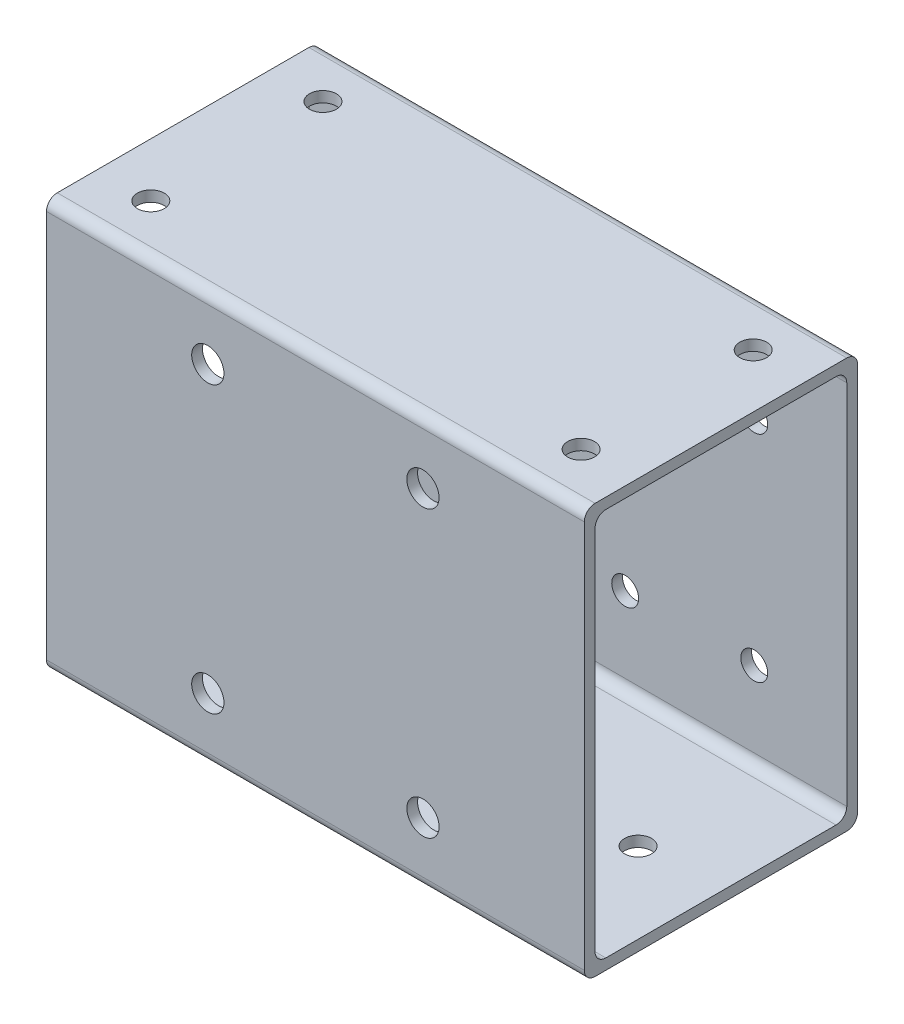
ISO-10303-21;
HEADER;
FILE_DESCRIPTION(('STEP AP214'),'2;1');
FILE_NAME('part.step','',(''),(''),'','','');
FILE_SCHEMA(('AUTOMOTIVE_DESIGN { 1 0 10303 214 1 1 1 1 }'));
ENDSEC;
DATA;
#1=APPLICATION_CONTEXT('core data for automotive mechanical design processes');
#2=APPLICATION_PROTOCOL_DEFINITION('international standard','automotive_design',2000,#1);
#3=PRODUCT_CONTEXT('',#1,'mechanical');
#4=PRODUCT('Part','Part','',(#3));
#5=PRODUCT_RELATED_PRODUCT_CATEGORY('part','',(#4));
#6=PRODUCT_DEFINITION_FORMATION('','',#4);
#7=PRODUCT_DEFINITION_CONTEXT('part definition',#1,'design');
#8=PRODUCT_DEFINITION('design','',#6,#7);
#9=PRODUCT_DEFINITION_SHAPE('','',#8);
#10=(LENGTH_UNIT() NAMED_UNIT(*) SI_UNIT(.MILLI.,.METRE.));
#11=(NAMED_UNIT(*) PLANE_ANGLE_UNIT() SI_UNIT($,.RADIAN.));
#12=(NAMED_UNIT(*) SI_UNIT($,.STERADIAN.) SOLID_ANGLE_UNIT());
#13=UNCERTAINTY_MEASURE_WITH_UNIT(LENGTH_MEASURE(1.E-05),#10,'distance_accuracy_value','');
#14=(GEOMETRIC_REPRESENTATION_CONTEXT(3) GLOBAL_UNCERTAINTY_ASSIGNED_CONTEXT((#13)) GLOBAL_UNIT_ASSIGNED_CONTEXT((#10,
#11,#12)) REPRESENTATION_CONTEXT('',''));
#15=CARTESIAN_POINT('',(0.,0.,0.));
#16=DIRECTION('',(0.,0.,1.));
#17=DIRECTION('',(1.,0.,0.));
#18=AXIS2_PLACEMENT_3D('',#15,#16,#17);
#19=CARTESIAN_POINT('',(-100.,38.1,25.4));
#20=DIRECTION('',(0.,0.,1.));
#21=DIRECTION('',(0.,-1.,0.));
#22=AXIS2_PLACEMENT_3D('',#19,#20,#21);
#23=PLANE('',#22);
#24=CARTESIAN_POINT('',(-30.,-26.5,25.4));
#25=DIRECTION('',(0.,0.,1.));
#26=DIRECTION('',(1.,0.,0.));
#27=AXIS2_PLACEMENT_3D('',#24,#25,#26);
#28=CIRCLE('',#27,3.);
#29=CARTESIAN_POINT('',(-27.,-26.5,25.4));
#30=VERTEX_POINT('',#29);
#31=EDGE_CURVE('E320',#30,#30,#28,.T.);
#32=ORIENTED_EDGE('',*,*,#31,.F.);
#33=EDGE_LOOP('',(#32));
#34=FACE_BOUND('',#33,.T.);
#35=CARTESIAN_POINT('',(-70.,-26.5,25.4));
#36=DIRECTION('',(0.,0.,1.));
#37=DIRECTION('',(1.,0.,0.));
#38=AXIS2_PLACEMENT_3D('',#35,#36,#37);
#39=CIRCLE('',#38,3.00000000000001);
#40=CARTESIAN_POINT('',(-67.,-26.5,25.4));
#41=VERTEX_POINT('',#40);
#42=EDGE_CURVE('E377',#41,#41,#39,.T.);
#43=ORIENTED_EDGE('',*,*,#42,.F.);
#44=EDGE_LOOP('',(#43));
#45=FACE_BOUND('',#44,.T.);
#46=CARTESIAN_POINT('',(-70.,26.5,25.4));
#47=DIRECTION('',(0.,0.,1.));
#48=DIRECTION('',(1.,0.,0.));
#49=AXIS2_PLACEMENT_3D('',#46,#47,#48);
#50=CIRCLE('',#49,3.00000000000001);
#51=CARTESIAN_POINT('',(-67.,26.5,25.4));
#52=VERTEX_POINT('',#51);
#53=EDGE_CURVE('E373',#52,#52,#50,.T.);
#54=ORIENTED_EDGE('',*,*,#53,.F.);
#55=EDGE_LOOP('',(#54));
#56=FACE_BOUND('',#55,.T.);
#57=CARTESIAN_POINT('',(-30.,26.5,25.4));
#58=DIRECTION('',(0.,0.,1.));
#59=DIRECTION('',(1.,0.,0.));
#60=AXIS2_PLACEMENT_3D('',#57,#58,#59);
#61=CIRCLE('',#60,3.);
#62=CARTESIAN_POINT('',(-27.,26.5,25.4));
#63=VERTEX_POINT('',#62);
#64=EDGE_CURVE('E290',#63,#63,#61,.T.);
#65=ORIENTED_EDGE('',*,*,#64,.F.);
#66=EDGE_LOOP('',(#65));
#67=FACE_BOUND('',#66,.T.);
#68=DIRECTION('',(0.,-1.,0.));
#69=VECTOR('',#68,1.);
#70=CARTESIAN_POINT('',(-100.,38.1,25.4));
#71=LINE('',#70,#69);
#72=CARTESIAN_POINT('',(-100.,36.1,25.4));
#73=VERTEX_POINT('',#72);
#74=CARTESIAN_POINT('',(-100.,-36.0999999999999,25.4));
#75=VERTEX_POINT('',#74);
#76=EDGE_CURVE('E418',#73,#75,#71,.T.);
#77=ORIENTED_EDGE('',*,*,#76,.T.);
#78=DIRECTION('',(1.,0.,0.));
#79=VECTOR('',#78,1.);
#80=CARTESIAN_POINT('',(-100.,-36.1,25.4));
#81=LINE('',#80,#79);
#82=CARTESIAN_POINT('',(0.,-36.0999999999999,25.4));
#83=VERTEX_POINT('',#82);
#84=EDGE_CURVE('E228',#75,#83,#81,.T.);
#85=ORIENTED_EDGE('',*,*,#84,.T.);
#86=DIRECTION('',(0.,-1.,0.));
#87=VECTOR('',#86,1.);
#88=CARTESIAN_POINT('',(0.,38.1,25.4));
#89=LINE('',#88,#87);
#90=CARTESIAN_POINT('',(0.,36.1,25.4));
#91=VERTEX_POINT('',#90);
#92=EDGE_CURVE('E166',#91,#83,#89,.T.);
#93=ORIENTED_EDGE('',*,*,#92,.F.);
#94=DIRECTION('',(1.,0.,0.));
#95=VECTOR('',#94,1.);
#96=CARTESIAN_POINT('',(-100.,36.1,25.4));
#97=LINE('',#96,#95);
#98=EDGE_CURVE('E225',#91,#73,#97,.F.);
#99=ORIENTED_EDGE('',*,*,#98,.T.);
#100=EDGE_LOOP('',(#77,#85,#93,#99));
#101=FACE_BOUND('',#100,.T.);
#102=ADVANCED_FACE('F44',(#34,#45,#56,#67,#101),#23,.T.);
#103=CARTESIAN_POINT('',(-100.,38.1,-25.4));
#104=DIRECTION('',(0.,1.,0.));
#105=DIRECTION('',(0.,0.,1.));
#106=AXIS2_PLACEMENT_3D('',#103,#104,#105);
#107=PLANE('',#106);
#108=CARTESIAN_POINT('',(-90.,38.1,16.));
#109=DIRECTION('',(0.,1.,0.));
#110=DIRECTION('',(0.,0.,1.));
#111=AXIS2_PLACEMENT_3D('',#108,#109,#110);
#112=CIRCLE('',#111,2.5);
#113=CARTESIAN_POINT('',(-90.,38.1,18.5));
#114=VERTEX_POINT('',#113);
#115=EDGE_CURVE('E881',#114,#114,#112,.T.);
#116=ORIENTED_EDGE('',*,*,#115,.F.);
#117=EDGE_LOOP('',(#116));
#118=FACE_BOUND('',#117,.T.);
#119=CARTESIAN_POINT('',(-10.,38.1,-16.));
#120=DIRECTION('',(0.,1.,0.));
#121=DIRECTION('',(0.,0.,1.));
#122=AXIS2_PLACEMENT_3D('',#119,#120,#121);
#123=CIRCLE('',#122,2.5);
#124=CARTESIAN_POINT('',(-10.,38.1,-13.5));
#125=VERTEX_POINT('',#124);
#126=EDGE_CURVE('E883',#125,#125,#123,.T.);
#127=ORIENTED_EDGE('',*,*,#126,.F.);
#128=EDGE_LOOP('',(#127));
#129=FACE_BOUND('',#128,.T.);
#130=CARTESIAN_POINT('',(-10.,38.1,16.));
#131=DIRECTION('',(0.,1.,0.));
#132=DIRECTION('',(0.,0.,1.));
#133=AXIS2_PLACEMENT_3D('',#130,#131,#132);
#134=CIRCLE('',#133,2.5);
#135=CARTESIAN_POINT('',(-10.,38.1,18.5));
#136=VERTEX_POINT('',#135);
#137=EDGE_CURVE('E889',#136,#136,#134,.T.);
#138=ORIENTED_EDGE('',*,*,#137,.F.);
#139=EDGE_LOOP('',(#138));
#140=FACE_BOUND('',#139,.T.);
#141=CARTESIAN_POINT('',(-90.,38.1,-16.));
#142=DIRECTION('',(0.,1.,0.));
#143=DIRECTION('',(0.,0.,1.));
#144=AXIS2_PLACEMENT_3D('',#141,#142,#143);
#145=CIRCLE('',#144,2.5);
#146=CARTESIAN_POINT('',(-90.,38.1,-13.5));
#147=VERTEX_POINT('',#146);
#148=EDGE_CURVE('E336',#147,#147,#145,.T.);
#149=ORIENTED_EDGE('',*,*,#148,.F.);
#150=EDGE_LOOP('',(#149));
#151=FACE_BOUND('',#150,.T.);
#152=DIRECTION('',(0.,0.,1.));
#153=VECTOR('',#152,1.);
#154=CARTESIAN_POINT('',(-100.,38.1,-25.4));
#155=LINE('',#154,#153);
#156=CARTESIAN_POINT('',(-100.,38.1,-23.4));
#157=VERTEX_POINT('',#156);
#158=CARTESIAN_POINT('',(-100.,38.1,23.4));
#159=VERTEX_POINT('',#158);
#160=EDGE_CURVE('E190',#157,#159,#155,.T.);
#161=ORIENTED_EDGE('',*,*,#160,.T.);
#162=DIRECTION('',(1.,0.,0.));
#163=VECTOR('',#162,1.);
#164=CARTESIAN_POINT('',(-100.,38.1,23.4));
#165=LINE('',#164,#163);
#166=CARTESIAN_POINT('',(0.,38.1,23.4));
#167=VERTEX_POINT('',#166);
#168=EDGE_CURVE('E233',#159,#167,#165,.T.);
#169=ORIENTED_EDGE('',*,*,#168,.T.);
#170=DIRECTION('',(0.,0.,1.));
#171=VECTOR('',#170,1.);
#172=CARTESIAN_POINT('',(0.,38.1,-25.4));
#173=LINE('',#172,#171);
#174=CARTESIAN_POINT('',(0.,38.1,-23.4));
#175=VERTEX_POINT('',#174);
#176=EDGE_CURVE('E199',#175,#167,#173,.T.);
#177=ORIENTED_EDGE('',*,*,#176,.F.);
#178=DIRECTION('',(1.,0.,0.));
#179=VECTOR('',#178,1.);
#180=CARTESIAN_POINT('',(-100.,38.1,-23.4));
#181=LINE('',#180,#179);
#182=EDGE_CURVE('E69',#175,#157,#181,.F.);
#183=ORIENTED_EDGE('',*,*,#182,.T.);
#184=EDGE_LOOP('',(#161,#169,#177,#183));
#185=FACE_BOUND('',#184,.T.);
#186=ADVANCED_FACE('F434',(#118,#129,#140,#151,#185),#107,.T.);
#187=CARTESIAN_POINT('',(-100.,38.1,-25.4));
#188=DIRECTION('',(0.,0.,-1.));
#189=DIRECTION('',(0.,1.,0.));
#190=AXIS2_PLACEMENT_3D('',#187,#188,#189);
#191=PLANE('',#190);
#192=CARTESIAN_POINT('',(-17.2,-20.,-25.4));
#193=DIRECTION('',(0.,0.,-1.));
#194=DIRECTION('',(0.,1.,0.));
#195=AXIS2_PLACEMENT_3D('',#192,#193,#194);
#196=CIRCLE('',#195,2.5);
#197=CARTESIAN_POINT('',(-17.2,-17.5,-25.4));
#198=VERTEX_POINT('',#197);
#199=EDGE_CURVE('E330',#198,#198,#196,.T.);
#200=ORIENTED_EDGE('',*,*,#199,.F.);
#201=EDGE_LOOP('',(#200));
#202=FACE_BOUND('',#201,.T.);
#203=CARTESIAN_POINT('',(-41.2,-20.,-25.4));
#204=DIRECTION('',(0.,0.,-1.));
#205=DIRECTION('',(0.,1.,0.));
#206=AXIS2_PLACEMENT_3D('',#203,#204,#205);
#207=CIRCLE('',#206,2.5);
#208=CARTESIAN_POINT('',(-41.2,-17.5,-25.4));
#209=VERTEX_POINT('',#208);
#210=EDGE_CURVE('E363',#209,#209,#207,.T.);
#211=ORIENTED_EDGE('',*,*,#210,.F.);
#212=EDGE_LOOP('',(#211));
#213=FACE_BOUND('',#212,.T.);
#214=CARTESIAN_POINT('',(-41.2,20.,-25.4));
#215=DIRECTION('',(0.,0.,-1.));
#216=DIRECTION('',(0.,1.,0.));
#217=AXIS2_PLACEMENT_3D('',#214,#215,#216);
#218=CIRCLE('',#217,2.5);
#219=CARTESIAN_POINT('',(-41.2,22.5,-25.4));
#220=VERTEX_POINT('',#219);
#221=EDGE_CURVE('E359',#220,#220,#218,.T.);
#222=ORIENTED_EDGE('',*,*,#221,.F.);
#223=EDGE_LOOP('',(#222));
#224=FACE_BOUND('',#223,.T.);
#225=CARTESIAN_POINT('',(-17.2,20.,-25.4));
#226=DIRECTION('',(0.,0.,-1.));
#227=DIRECTION('',(0.,1.,0.));
#228=AXIS2_PLACEMENT_3D('',#225,#226,#227);
#229=CIRCLE('',#228,2.5);
#230=CARTESIAN_POINT('',(-17.2,22.5,-25.4));
#231=VERTEX_POINT('',#230);
#232=EDGE_CURVE('E308',#231,#231,#229,.T.);
#233=ORIENTED_EDGE('',*,*,#232,.F.);
#234=EDGE_LOOP('',(#233));
#235=FACE_BOUND('',#234,.T.);
#236=DIRECTION('',(0.,1.,0.));
#237=VECTOR('',#236,1.);
#238=CARTESIAN_POINT('',(0.,38.1,-25.4));
#239=LINE('',#238,#237);
#240=CARTESIAN_POINT('',(0.,-36.0999999999999,-25.4));
#241=VERTEX_POINT('',#240);
#242=CARTESIAN_POINT('',(0.,36.1,-25.4));
#243=VERTEX_POINT('',#242);
#244=EDGE_CURVE('E184',#241,#243,#239,.T.);
#245=ORIENTED_EDGE('',*,*,#244,.F.);
#246=DIRECTION('',(1.,0.,0.));
#247=VECTOR('',#246,1.);
#248=CARTESIAN_POINT('',(-100.,-36.1,-25.4));
#249=LINE('',#248,#247);
#250=CARTESIAN_POINT('',(-100.,-36.0999999999999,-25.4));
#251=VERTEX_POINT('',#250);
#252=EDGE_CURVE('E212',#241,#251,#249,.F.);
#253=ORIENTED_EDGE('',*,*,#252,.T.);
#254=DIRECTION('',(0.,1.,0.));
#255=VECTOR('',#254,1.);
#256=CARTESIAN_POINT('',(-100.,38.1,-25.4));
#257=LINE('',#256,#255);
#258=CARTESIAN_POINT('',(-100.,36.1,-25.4));
#259=VERTEX_POINT('',#258);
#260=EDGE_CURVE('E196',#251,#259,#257,.T.);
#261=ORIENTED_EDGE('',*,*,#260,.T.);
#262=DIRECTION('',(1.,0.,0.));
#263=VECTOR('',#262,1.);
#264=CARTESIAN_POINT('',(-100.,36.1,-25.4));
#265=LINE('',#264,#263);
#266=EDGE_CURVE('E208',#259,#243,#265,.T.);
#267=ORIENTED_EDGE('',*,*,#266,.T.);
#268=EDGE_LOOP('',(#245,#253,#261,#267));
#269=FACE_BOUND('',#268,.T.);
#270=ADVANCED_FACE('F444',(#202,#213,#224,#235,#269),#191,.T.);
#271=CARTESIAN_POINT('',(-100.,-38.1,-25.4));
#272=DIRECTION('',(0.,-1.,0.));
#273=DIRECTION('',(0.,0.,-1.));
#274=AXIS2_PLACEMENT_3D('',#271,#272,#273);
#275=PLANE('',#274);
#276=CARTESIAN_POINT('',(-15.,-38.1,0.399999999999992));
#277=DIRECTION('',(0.,-1.,0.));
#278=DIRECTION('',(0.,0.,-1.));
#279=AXIS2_PLACEMENT_3D('',#276,#277,#278);
#280=CIRCLE('',#279,2.5);
#281=CARTESIAN_POINT('',(-15.,-38.1,-2.10000000000001));
#282=VERTEX_POINT('',#281);
#283=EDGE_CURVE('E326',#282,#282,#280,.T.);
#284=ORIENTED_EDGE('',*,*,#283,.F.);
#285=EDGE_LOOP('',(#284));
#286=FACE_BOUND('',#285,.T.);
#287=CARTESIAN_POINT('',(-80.,-38.1,0.399999999999986));
#288=DIRECTION('',(0.,-1.,0.));
#289=DIRECTION('',(0.,0.,-1.));
#290=AXIS2_PLACEMENT_3D('',#287,#288,#289);
#291=CIRCLE('',#290,2.50000000000001);
#292=CARTESIAN_POINT('',(-80.,-38.1,-2.10000000000002));
#293=VERTEX_POINT('',#292);
#294=EDGE_CURVE('E346',#293,#293,#291,.T.);
#295=ORIENTED_EDGE('',*,*,#294,.F.);
#296=EDGE_LOOP('',(#295));
#297=FACE_BOUND('',#296,.T.);
#298=DIRECTION('',(0.,0.,-1.));
#299=VECTOR('',#298,1.);
#300=CARTESIAN_POINT('',(-100.,-38.1,-25.4));
#301=LINE('',#300,#299);
#302=CARTESIAN_POINT('',(-100.,-38.1,23.4));
#303=VERTEX_POINT('',#302);
#304=CARTESIAN_POINT('',(-100.,-38.1,-23.4));
#305=VERTEX_POINT('',#304);
#306=EDGE_CURVE('E422',#303,#305,#301,.T.);
#307=ORIENTED_EDGE('',*,*,#306,.T.);
#308=DIRECTION('',(1.,0.,0.));
#309=VECTOR('',#308,1.);
#310=CARTESIAN_POINT('',(-100.,-38.1,-23.4));
#311=LINE('',#310,#309);
#312=CARTESIAN_POINT('',(0.,-38.1,-23.4));
#313=VERTEX_POINT('',#312);
#314=EDGE_CURVE('E182',#305,#313,#311,.T.);
#315=ORIENTED_EDGE('',*,*,#314,.T.);
#316=DIRECTION('',(0.,0.,-1.));
#317=VECTOR('',#316,1.);
#318=CARTESIAN_POINT('',(0.,-38.1,-25.4));
#319=LINE('',#318,#317);
#320=CARTESIAN_POINT('',(0.,-38.1,23.4));
#321=VERTEX_POINT('',#320);
#322=EDGE_CURVE('E164',#321,#313,#319,.T.);
#323=ORIENTED_EDGE('',*,*,#322,.F.);
#324=DIRECTION('',(1.,0.,0.));
#325=VECTOR('',#324,1.);
#326=CARTESIAN_POINT('',(-100.,-38.1,23.4));
#327=LINE('',#326,#325);
#328=EDGE_CURVE('E179',#321,#303,#327,.F.);
#329=ORIENTED_EDGE('',*,*,#328,.T.);
#330=EDGE_LOOP('',(#307,#315,#323,#329));
#331=FACE_BOUND('',#330,.T.);
#332=ADVANCED_FACE('F178',(#286,#297,#331),#275,.T.);
#333=CARTESIAN_POINT('',(-100.,0.,0.));
#334=DIRECTION('',(-1.,0.,0.));
#335=DIRECTION('',(0.,0.,1.));
#336=AXIS2_PLACEMENT_3D('',#333,#334,#335);
#337=PLANE('',#336);
#338=DIRECTION('',(0.,0.,1.));
#339=VECTOR('',#338,1.);
#340=CARTESIAN_POINT('',(-100.,36.1,-23.4));
#341=LINE('',#340,#339);
#342=CARTESIAN_POINT('',(-100.,36.1,-21.4));
#343=VERTEX_POINT('',#342);
#344=CARTESIAN_POINT('',(-100.,36.1,21.4));
#345=VERTEX_POINT('',#344);
#346=EDGE_CURVE('E400',#343,#345,#341,.T.);
#347=ORIENTED_EDGE('',*,*,#346,.T.);
#348=CARTESIAN_POINT('',(-100.,34.1,21.4));
#349=DIRECTION('',(-1.,0.,0.));
#350=DIRECTION('',(0.,0.,1.));
#351=AXIS2_PLACEMENT_3D('',#348,#349,#350);
#352=CIRCLE('',#351,2.);
#353=CARTESIAN_POINT('',(-100.,34.1,23.4));
#354=VERTEX_POINT('',#353);
#355=EDGE_CURVE('E11',#345,#354,#352,.F.);
#356=ORIENTED_EDGE('',*,*,#355,.T.);
#357=DIRECTION('',(0.,-1.,0.));
#358=VECTOR('',#357,1.);
#359=CARTESIAN_POINT('',(-100.,36.1,23.4));
#360=LINE('',#359,#358);
#361=CARTESIAN_POINT('',(-100.,-34.1,23.4));
#362=VERTEX_POINT('',#361);
#363=EDGE_CURVE('E387',#354,#362,#360,.T.);
#364=ORIENTED_EDGE('',*,*,#363,.T.);
#365=CARTESIAN_POINT('',(-100.,-34.1,21.4));
#366=DIRECTION('',(-1.,0.,0.));
#367=DIRECTION('',(0.,0.,1.));
#368=AXIS2_PLACEMENT_3D('',#365,#366,#367);
#369=CIRCLE('',#368,2.);
#370=CARTESIAN_POINT('',(-100.,-36.1,21.4));
#371=VERTEX_POINT('',#370);
#372=EDGE_CURVE('E280',#362,#371,#369,.F.);
#373=ORIENTED_EDGE('',*,*,#372,.T.);
#374=DIRECTION('',(0.,0.,-1.));
#375=VECTOR('',#374,1.);
#376=CARTESIAN_POINT('',(-100.,-36.1,-23.4));
#377=LINE('',#376,#375);
#378=CARTESIAN_POINT('',(-100.,-36.1,-21.4));
#379=VERTEX_POINT('',#378);
#380=EDGE_CURVE('E391',#371,#379,#377,.T.);
#381=ORIENTED_EDGE('',*,*,#380,.T.);
#382=CARTESIAN_POINT('',(-100.,-34.1,-21.4));
#383=DIRECTION('',(-1.,0.,0.));
#384=DIRECTION('',(0.,0.,1.));
#385=AXIS2_PLACEMENT_3D('',#382,#383,#384);
#386=CIRCLE('',#385,2.);
#387=CARTESIAN_POINT('',(-100.,-34.1,-23.4));
#388=VERTEX_POINT('',#387);
#389=EDGE_CURVE('E268',#379,#388,#386,.F.);
#390=ORIENTED_EDGE('',*,*,#389,.T.);
#391=DIRECTION('',(0.,1.,0.));
#392=VECTOR('',#391,1.);
#393=CARTESIAN_POINT('',(-100.,36.1,-23.4));
#394=LINE('',#393,#392);
#395=CARTESIAN_POINT('',(-100.,34.1,-23.4));
#396=VERTEX_POINT('',#395);
#397=EDGE_CURVE('E396',#388,#396,#394,.T.);
#398=ORIENTED_EDGE('',*,*,#397,.T.);
#399=CARTESIAN_POINT('',(-100.,34.1,-21.4));
#400=DIRECTION('',(-1.,0.,0.));
#401=DIRECTION('',(0.,0.,1.));
#402=AXIS2_PLACEMENT_3D('',#399,#400,#401);
#403=CIRCLE('',#402,2.);
#404=EDGE_CURVE('E274',#396,#343,#403,.F.);
#405=ORIENTED_EDGE('',*,*,#404,.T.);
#406=EDGE_LOOP('',(#347,#356,#364,#373,#381,#390,#398,#405));
#407=FACE_BOUND('',#406,.T.);
#408=ORIENTED_EDGE('',*,*,#260,.F.);
#409=CARTESIAN_POINT('',(-100.,-36.1,-23.4));
#410=DIRECTION('',(-1.,0.,0.));
#411=DIRECTION('',(0.,0.,1.));
#412=AXIS2_PLACEMENT_3D('',#409,#410,#411);
#413=CIRCLE('',#412,2.);
#414=EDGE_CURVE('E222',#251,#305,#413,.T.);
#415=ORIENTED_EDGE('',*,*,#414,.T.);
#416=ORIENTED_EDGE('',*,*,#306,.F.);
#417=CARTESIAN_POINT('',(-100.,-36.1,23.4));
#418=DIRECTION('',(-1.,0.,0.));
#419=DIRECTION('',(0.,0.,1.));
#420=AXIS2_PLACEMENT_3D('',#417,#418,#419);
#421=CIRCLE('',#420,2.);
#422=EDGE_CURVE('E188',#303,#75,#421,.T.);
#423=ORIENTED_EDGE('',*,*,#422,.T.);
#424=ORIENTED_EDGE('',*,*,#76,.F.);
#425=CARTESIAN_POINT('',(-100.,36.1,23.4));
#426=DIRECTION('',(-1.,0.,0.));
#427=DIRECTION('',(0.,0.,1.));
#428=AXIS2_PLACEMENT_3D('',#425,#426,#427);
#429=CIRCLE('',#428,2.);
#430=EDGE_CURVE('E62',#73,#159,#429,.T.);
#431=ORIENTED_EDGE('',*,*,#430,.T.);
#432=ORIENTED_EDGE('',*,*,#160,.F.);
#433=CARTESIAN_POINT('',(-100.,36.1,-23.4));
#434=DIRECTION('',(-1.,0.,0.));
#435=DIRECTION('',(0.,0.,1.));
#436=AXIS2_PLACEMENT_3D('',#433,#434,#435);
#437=CIRCLE('',#436,2.);
#438=EDGE_CURVE('E215',#157,#259,#437,.T.);
#439=ORIENTED_EDGE('',*,*,#438,.T.);
#440=EDGE_LOOP('',(#408,#415,#416,#423,#424,#431,#432,#439));
#441=FACE_BOUND('',#440,.T.);
#442=ADVANCED_FACE('F441',(#407,#441),#337,.T.);
#443=CARTESIAN_POINT('',(0.,0.,0.));
#444=DIRECTION('',(-1.,0.,0.));
#445=DIRECTION('',(0.,0.,1.));
#446=AXIS2_PLACEMENT_3D('',#443,#444,#445);
#447=PLANE('',#446);
#448=DIRECTION('',(0.,0.,-1.));
#449=VECTOR('',#448,1.);
#450=CARTESIAN_POINT('',(0.,-36.1,-23.4));
#451=LINE('',#450,#449);
#452=CARTESIAN_POINT('',(0.,-36.1,21.4));
#453=VERTEX_POINT('',#452);
#454=CARTESIAN_POINT('',(0.,-36.1,-21.4));
#455=VERTEX_POINT('',#454);
#456=EDGE_CURVE('E407',#453,#455,#451,.T.);
#457=ORIENTED_EDGE('',*,*,#456,.F.);
#458=CARTESIAN_POINT('',(0.,-34.1,21.4));
#459=DIRECTION('',(-1.,0.,0.));
#460=DIRECTION('',(0.,0.,1.));
#461=AXIS2_PLACEMENT_3D('',#458,#459,#460);
#462=CIRCLE('',#461,2.);
#463=CARTESIAN_POINT('',(0.,-34.1,23.4));
#464=VERTEX_POINT('',#463);
#465=EDGE_CURVE('E277',#453,#464,#462,.T.);
#466=ORIENTED_EDGE('',*,*,#465,.T.);
#467=DIRECTION('',(0.,-1.,0.));
#468=VECTOR('',#467,1.);
#469=CARTESIAN_POINT('',(0.,36.1,23.4));
#470=LINE('',#469,#468);
#471=CARTESIAN_POINT('',(0.,34.1,23.4));
#472=VERTEX_POINT('',#471);
#473=EDGE_CURVE('E302',#472,#464,#470,.T.);
#474=ORIENTED_EDGE('',*,*,#473,.F.);
#475=CARTESIAN_POINT('',(0.,34.1,21.4));
#476=DIRECTION('',(-1.,0.,0.));
#477=DIRECTION('',(0.,0.,1.));
#478=AXIS2_PLACEMENT_3D('',#475,#476,#477);
#479=CIRCLE('',#478,2.);
#480=CARTESIAN_POINT('',(0.,36.1,21.4));
#481=VERTEX_POINT('',#480);
#482=EDGE_CURVE('E54',#472,#481,#479,.T.);
#483=ORIENTED_EDGE('',*,*,#482,.T.);
#484=DIRECTION('',(0.,0.,1.));
#485=VECTOR('',#484,1.);
#486=CARTESIAN_POINT('',(0.,36.1,-23.4));
#487=LINE('',#486,#485);
#488=CARTESIAN_POINT('',(0.,36.1,-21.4));
#489=VERTEX_POINT('',#488);
#490=EDGE_CURVE('E392',#489,#481,#487,.T.);
#491=ORIENTED_EDGE('',*,*,#490,.F.);
#492=CARTESIAN_POINT('',(0.,34.1,-21.4));
#493=DIRECTION('',(-1.,0.,0.));
#494=DIRECTION('',(0.,0.,1.));
#495=AXIS2_PLACEMENT_3D('',#492,#493,#494);
#496=CIRCLE('',#495,2.);
#497=CARTESIAN_POINT('',(0.,34.1,-23.4));
#498=VERTEX_POINT('',#497);
#499=EDGE_CURVE('E271',#489,#498,#496,.T.);
#500=ORIENTED_EDGE('',*,*,#499,.T.);
#501=DIRECTION('',(0.,1.,0.));
#502=VECTOR('',#501,1.);
#503=CARTESIAN_POINT('',(0.,36.1,-23.4));
#504=LINE('',#503,#502);
#505=CARTESIAN_POINT('',(0.,-34.1,-23.4));
#506=VERTEX_POINT('',#505);
#507=EDGE_CURVE('E411',#506,#498,#504,.T.);
#508=ORIENTED_EDGE('',*,*,#507,.F.);
#509=CARTESIAN_POINT('',(0.,-34.1,-21.4));
#510=DIRECTION('',(-1.,0.,0.));
#511=DIRECTION('',(0.,0.,1.));
#512=AXIS2_PLACEMENT_3D('',#509,#510,#511);
#513=CIRCLE('',#512,2.);
#514=EDGE_CURVE('E265',#506,#455,#513,.T.);
#515=ORIENTED_EDGE('',*,*,#514,.T.);
#516=EDGE_LOOP('',(#457,#466,#474,#483,#491,#500,#508,#515));
#517=FACE_BOUND('',#516,.T.);
#518=ORIENTED_EDGE('',*,*,#322,.T.);
#519=CARTESIAN_POINT('',(0.,-36.1,-23.4));
#520=DIRECTION('',(-1.,0.,0.));
#521=DIRECTION('',(0.,0.,1.));
#522=AXIS2_PLACEMENT_3D('',#519,#520,#521);
#523=CIRCLE('',#522,2.);
#524=EDGE_CURVE('E172',#313,#241,#523,.F.);
#525=ORIENTED_EDGE('',*,*,#524,.T.);
#526=ORIENTED_EDGE('',*,*,#244,.T.);
#527=CARTESIAN_POINT('',(0.,36.1,-23.4));
#528=DIRECTION('',(-1.,0.,0.));
#529=DIRECTION('',(0.,0.,1.));
#530=AXIS2_PLACEMENT_3D('',#527,#528,#529);
#531=CIRCLE('',#530,2.);
#532=EDGE_CURVE('E194',#243,#175,#531,.F.);
#533=ORIENTED_EDGE('',*,*,#532,.T.);
#534=ORIENTED_EDGE('',*,*,#176,.T.);
#535=CARTESIAN_POINT('',(0.,36.1,23.4));
#536=DIRECTION('',(-1.,0.,0.));
#537=DIRECTION('',(0.,0.,1.));
#538=AXIS2_PLACEMENT_3D('',#535,#536,#537);
#539=CIRCLE('',#538,2.);
#540=EDGE_CURVE('E173',#167,#91,#539,.F.);
#541=ORIENTED_EDGE('',*,*,#540,.T.);
#542=ORIENTED_EDGE('',*,*,#92,.T.);
#543=CARTESIAN_POINT('',(0.,-36.1,23.4));
#544=DIRECTION('',(-1.,0.,0.));
#545=DIRECTION('',(0.,0.,1.));
#546=AXIS2_PLACEMENT_3D('',#543,#544,#545);
#547=CIRCLE('',#546,2.);
#548=EDGE_CURVE('E161',#83,#321,#547,.F.);
#549=ORIENTED_EDGE('',*,*,#548,.T.);
#550=EDGE_LOOP('',(#518,#525,#526,#533,#534,#541,#542,#549));
#551=FACE_BOUND('',#550,.T.);
#552=ADVANCED_FACE('F163',(#517,#551),#447,.F.);
#553=CARTESIAN_POINT('',(-100.,36.1,23.4));
#554=DIRECTION('',(0.,0.,1.));
#555=DIRECTION('',(1.,0.,0.));
#556=AXIS2_PLACEMENT_3D('',#553,#554,#555);
#557=PLANE('',#556);
#558=CARTESIAN_POINT('',(-30.,-26.5,23.4));
#559=DIRECTION('',(0.,0.,1.));
#560=DIRECTION('',(1.,0.,0.));
#561=AXIS2_PLACEMENT_3D('',#558,#559,#560);
#562=CIRCLE('',#561,3.);
#563=CARTESIAN_POINT('',(-27.,-26.5,23.4));
#564=VERTEX_POINT('',#563);
#565=EDGE_CURVE('E298',#564,#564,#562,.T.);
#566=ORIENTED_EDGE('',*,*,#565,.T.);
#567=EDGE_LOOP('',(#566));
#568=FACE_BOUND('',#567,.T.);
#569=CARTESIAN_POINT('',(-70.,-26.5,23.4));
#570=DIRECTION('',(0.,0.,1.));
#571=DIRECTION('',(1.,0.,0.));
#572=AXIS2_PLACEMENT_3D('',#569,#570,#571);
#573=CIRCLE('',#572,3.00000000000001);
#574=CARTESIAN_POINT('',(-67.,-26.5,23.4));
#575=VERTEX_POINT('',#574);
#576=EDGE_CURVE('E294',#575,#575,#573,.T.);
#577=ORIENTED_EDGE('',*,*,#576,.T.);
#578=EDGE_LOOP('',(#577));
#579=FACE_BOUND('',#578,.T.);
#580=CARTESIAN_POINT('',(-70.,26.5,23.4));
#581=DIRECTION('',(0.,0.,1.));
#582=DIRECTION('',(1.,0.,0.));
#583=AXIS2_PLACEMENT_3D('',#580,#581,#582);
#584=CIRCLE('',#583,3.00000000000001);
#585=CARTESIAN_POINT('',(-67.,26.5,23.4));
#586=VERTEX_POINT('',#585);
#587=EDGE_CURVE('E289',#586,#586,#584,.T.);
#588=ORIENTED_EDGE('',*,*,#587,.T.);
#589=EDGE_LOOP('',(#588));
#590=FACE_BOUND('',#589,.T.);
#591=CARTESIAN_POINT('',(-30.,26.5,23.4));
#592=DIRECTION('',(0.,0.,1.));
#593=DIRECTION('',(1.,0.,0.));
#594=AXIS2_PLACEMENT_3D('',#591,#592,#593);
#595=CIRCLE('',#594,3.);
#596=CARTESIAN_POINT('',(-27.,26.5,23.4));
#597=VERTEX_POINT('',#596);
#598=EDGE_CURVE('E285',#597,#597,#595,.T.);
#599=ORIENTED_EDGE('',*,*,#598,.T.);
#600=EDGE_LOOP('',(#599));
#601=FACE_BOUND('',#600,.T.);
#602=ORIENTED_EDGE('',*,*,#473,.T.);
#603=DIRECTION('',(1.,0.,0.));
#604=VECTOR('',#603,1.);
#605=CARTESIAN_POINT('',(-100.,-34.1,23.4));
#606=LINE('',#605,#604);
#607=EDGE_CURVE('E262',#464,#362,#606,.F.);
#608=ORIENTED_EDGE('',*,*,#607,.T.);
#609=ORIENTED_EDGE('',*,*,#363,.F.);
#610=DIRECTION('',(1.,0.,0.));
#611=VECTOR('',#610,1.);
#612=CARTESIAN_POINT('',(0.,34.1,23.4));
#613=LINE('',#612,#611);
#614=EDGE_CURVE('E258',#354,#472,#613,.T.);
#615=ORIENTED_EDGE('',*,*,#614,.T.);
#616=EDGE_LOOP('',(#602,#608,#609,#615));
#617=FACE_BOUND('',#616,.T.);
#618=ADVANCED_FACE('F491',(#568,#579,#590,#601,#617),#557,.F.);
#619=CARTESIAN_POINT('',(-100.,36.1,-23.4));
#620=DIRECTION('',(0.,1.,0.));
#621=DIRECTION('',(0.,0.,1.));
#622=AXIS2_PLACEMENT_3D('',#619,#620,#621);
#623=PLANE('',#622);
#624=CARTESIAN_POINT('',(-90.,36.1,16.));
#625=DIRECTION('',(0.,1.,0.));
#626=DIRECTION('',(0.,0.,1.));
#627=AXIS2_PLACEMENT_3D('',#624,#625,#626);
#628=CIRCLE('',#627,2.5);
#629=CARTESIAN_POINT('',(-90.,36.1,18.5));
#630=VERTEX_POINT('',#629);
#631=EDGE_CURVE('E48',#630,#630,#628,.T.);
#632=ORIENTED_EDGE('',*,*,#631,.T.);
#633=EDGE_LOOP('',(#632));
#634=FACE_BOUND('',#633,.T.);
#635=CARTESIAN_POINT('',(-10.,36.1,-16.));
#636=DIRECTION('',(0.,1.,0.));
#637=DIRECTION('',(0.,0.,1.));
#638=AXIS2_PLACEMENT_3D('',#635,#636,#637);
#639=CIRCLE('',#638,2.5);
#640=CARTESIAN_POINT('',(-10.,36.1,-13.5));
#641=VERTEX_POINT('',#640);
#642=EDGE_CURVE('E339',#641,#641,#639,.T.);
#643=ORIENTED_EDGE('',*,*,#642,.T.);
#644=EDGE_LOOP('',(#643));
#645=FACE_BOUND('',#644,.T.);
#646=CARTESIAN_POINT('',(-10.,36.1,16.));
#647=DIRECTION('',(0.,1.,0.));
#648=DIRECTION('',(0.,0.,1.));
#649=AXIS2_PLACEMENT_3D('',#646,#647,#648);
#650=CIRCLE('',#649,2.5);
#651=CARTESIAN_POINT('',(-10.,36.1,18.5));
#652=VERTEX_POINT('',#651);
#653=EDGE_CURVE('E335',#652,#652,#650,.T.);
#654=ORIENTED_EDGE('',*,*,#653,.T.);
#655=EDGE_LOOP('',(#654));
#656=FACE_BOUND('',#655,.T.);
#657=CARTESIAN_POINT('',(-90.,36.1,-16.));
#658=DIRECTION('',(0.,1.,0.));
#659=DIRECTION('',(0.,0.,1.));
#660=AXIS2_PLACEMENT_3D('',#657,#658,#659);
#661=CIRCLE('',#660,2.5);
#662=CARTESIAN_POINT('',(-90.,36.1,-13.5));
#663=VERTEX_POINT('',#662);
#664=EDGE_CURVE('E331',#663,#663,#661,.T.);
#665=ORIENTED_EDGE('',*,*,#664,.T.);
#666=EDGE_LOOP('',(#665));
#667=FACE_BOUND('',#666,.T.);
#668=ORIENTED_EDGE('',*,*,#346,.F.);
#669=DIRECTION('',(1.,0.,0.));
#670=VECTOR('',#669,1.);
#671=CARTESIAN_POINT('',(0.,36.1,-21.4));
#672=LINE('',#671,#670);
#673=EDGE_CURVE('E254',#343,#489,#672,.T.);
#674=ORIENTED_EDGE('',*,*,#673,.T.);
#675=ORIENTED_EDGE('',*,*,#490,.T.);
#676=DIRECTION('',(1.,0.,0.));
#677=VECTOR('',#676,1.);
#678=CARTESIAN_POINT('',(-100.,36.1,21.4));
#679=LINE('',#678,#677);
#680=EDGE_CURVE('E251',#481,#345,#679,.F.);
#681=ORIENTED_EDGE('',*,*,#680,.T.);
#682=EDGE_LOOP('',(#668,#674,#675,#681));
#683=FACE_BOUND('',#682,.T.);
#684=ADVANCED_FACE('F485',(#634,#645,#656,#667,#683),#623,.F.);
#685=CARTESIAN_POINT('',(-100.,36.1,-23.4));
#686=DIRECTION('',(0.,0.,-1.));
#687=DIRECTION('',(-1.,0.,0.));
#688=AXIS2_PLACEMENT_3D('',#685,#686,#687);
#689=PLANE('',#688);
#690=CARTESIAN_POINT('',(-17.2,-20.,-23.4));
#691=DIRECTION('',(0.,0.,-1.));
#692=DIRECTION('',(-1.,0.,0.));
#693=AXIS2_PLACEMENT_3D('',#690,#691,#692);
#694=CIRCLE('',#693,2.5);
#695=CARTESIAN_POINT('',(-19.7,-20.,-23.4));
#696=VERTEX_POINT('',#695);
#697=EDGE_CURVE('E316',#696,#696,#694,.T.);
#698=ORIENTED_EDGE('',*,*,#697,.T.);
#699=EDGE_LOOP('',(#698));
#700=FACE_BOUND('',#699,.T.);
#701=CARTESIAN_POINT('',(-41.2,-20.,-23.4));
#702=DIRECTION('',(0.,0.,-1.));
#703=DIRECTION('',(-1.,0.,0.));
#704=AXIS2_PLACEMENT_3D('',#701,#702,#703);
#705=CIRCLE('',#704,2.5);
#706=CARTESIAN_POINT('',(-43.7,-20.,-23.4));
#707=VERTEX_POINT('',#706);
#708=EDGE_CURVE('E312',#707,#707,#705,.T.);
#709=ORIENTED_EDGE('',*,*,#708,.T.);
#710=EDGE_LOOP('',(#709));
#711=FACE_BOUND('',#710,.T.);
#712=CARTESIAN_POINT('',(-41.2,20.,-23.4));
#713=DIRECTION('',(0.,0.,-1.));
#714=DIRECTION('',(-1.,0.,0.));
#715=AXIS2_PLACEMENT_3D('',#712,#713,#714);
#716=CIRCLE('',#715,2.5);
#717=CARTESIAN_POINT('',(-43.7,20.,-23.4));
#718=VERTEX_POINT('',#717);
#719=EDGE_CURVE('E307',#718,#718,#716,.T.);
#720=ORIENTED_EDGE('',*,*,#719,.T.);
#721=EDGE_LOOP('',(#720));
#722=FACE_BOUND('',#721,.T.);
#723=CARTESIAN_POINT('',(-17.2,20.,-23.4));
#724=DIRECTION('',(0.,0.,-1.));
#725=DIRECTION('',(-1.,0.,0.));
#726=AXIS2_PLACEMENT_3D('',#723,#724,#725);
#727=CIRCLE('',#726,2.5);
#728=CARTESIAN_POINT('',(-19.7,20.,-23.4));
#729=VERTEX_POINT('',#728);
#730=EDGE_CURVE('E303',#729,#729,#727,.T.);
#731=ORIENTED_EDGE('',*,*,#730,.T.);
#732=EDGE_LOOP('',(#731));
#733=FACE_BOUND('',#732,.T.);
#734=ORIENTED_EDGE('',*,*,#397,.F.);
#735=DIRECTION('',(1.,0.,0.));
#736=VECTOR('',#735,1.);
#737=CARTESIAN_POINT('',(0.,-34.1,-23.4));
#738=LINE('',#737,#736);
#739=EDGE_CURVE('E240',#388,#506,#738,.T.);
#740=ORIENTED_EDGE('',*,*,#739,.T.);
#741=ORIENTED_EDGE('',*,*,#507,.T.);
#742=DIRECTION('',(1.,0.,0.));
#743=VECTOR('',#742,1.);
#744=CARTESIAN_POINT('',(-100.,34.1,-23.4));
#745=LINE('',#744,#743);
#746=EDGE_CURVE('E237',#498,#396,#745,.F.);
#747=ORIENTED_EDGE('',*,*,#746,.T.);
#748=EDGE_LOOP('',(#734,#740,#741,#747));
#749=FACE_BOUND('',#748,.T.);
#750=ADVANCED_FACE('F479',(#700,#711,#722,#733,#749),#689,.F.);
#751=CARTESIAN_POINT('',(-100.,-36.1,-23.4));
#752=DIRECTION('',(0.,-1.,0.));
#753=DIRECTION('',(0.,0.,-1.));
#754=AXIS2_PLACEMENT_3D('',#751,#752,#753);
#755=PLANE('',#754);
#756=CARTESIAN_POINT('',(-15.,-36.1,0.399999999999993));
#757=DIRECTION('',(0.,-1.,0.));
#758=DIRECTION('',(0.,0.,-1.));
#759=AXIS2_PLACEMENT_3D('',#756,#757,#758);
#760=CIRCLE('',#759,2.5);
#761=CARTESIAN_POINT('',(-15.,-36.1,-2.10000000000001));
#762=VERTEX_POINT('',#761);
#763=EDGE_CURVE('E325',#762,#762,#760,.T.);
#764=ORIENTED_EDGE('',*,*,#763,.T.);
#765=EDGE_LOOP('',(#764));
#766=FACE_BOUND('',#765,.T.);
#767=CARTESIAN_POINT('',(-80.,-36.1,0.399999999999986));
#768=DIRECTION('',(0.,-1.,0.));
#769=DIRECTION('',(0.,0.,-1.));
#770=AXIS2_PLACEMENT_3D('',#767,#768,#769);
#771=CIRCLE('',#770,2.50000000000001);
#772=CARTESIAN_POINT('',(-80.,-36.1,-2.10000000000002));
#773=VERTEX_POINT('',#772);
#774=EDGE_CURVE('E321',#773,#773,#771,.T.);
#775=ORIENTED_EDGE('',*,*,#774,.T.);
#776=EDGE_LOOP('',(#775));
#777=FACE_BOUND('',#776,.T.);
#778=ORIENTED_EDGE('',*,*,#456,.T.);
#779=DIRECTION('',(1.,0.,0.));
#780=VECTOR('',#779,1.);
#781=CARTESIAN_POINT('',(-100.,-36.1,-21.4));
#782=LINE('',#781,#780);
#783=EDGE_CURVE('E248',#455,#379,#782,.F.);
#784=ORIENTED_EDGE('',*,*,#783,.T.);
#785=ORIENTED_EDGE('',*,*,#380,.F.);
#786=DIRECTION('',(1.,0.,0.));
#787=VECTOR('',#786,1.);
#788=CARTESIAN_POINT('',(0.,-36.1,21.4));
#789=LINE('',#788,#787);
#790=EDGE_CURVE('E244',#371,#453,#789,.T.);
#791=ORIENTED_EDGE('',*,*,#790,.T.);
#792=EDGE_LOOP('',(#778,#784,#785,#791));
#793=FACE_BOUND('',#792,.T.);
#794=ADVANCED_FACE('F475',(#766,#777,#793),#755,.F.);
#795=CARTESIAN_POINT('',(-100.,-36.1,-23.4));
#796=DIRECTION('',(1.,0.,0.));
#797=DIRECTION('',(0.,0.,-1.));
#798=AXIS2_PLACEMENT_3D('',#795,#796,#797);
#799=CYLINDRICAL_SURFACE('',#798,2.);
#800=ORIENTED_EDGE('',*,*,#414,.F.);
#801=ORIENTED_EDGE('',*,*,#252,.F.);
#802=ORIENTED_EDGE('',*,*,#524,.F.);
#803=ORIENTED_EDGE('',*,*,#314,.F.);
#804=EDGE_LOOP('',(#800,#801,#802,#803));
#805=FACE_BOUND('',#804,.T.);
#806=ADVANCED_FACE('F447',(#805),#799,.T.);
#807=CARTESIAN_POINT('',(-100.,-36.1,23.4));
#808=DIRECTION('',(1.,0.,0.));
#809=DIRECTION('',(0.,0.,-1.));
#810=AXIS2_PLACEMENT_3D('',#807,#808,#809);
#811=CYLINDRICAL_SURFACE('',#810,2.);
#812=ORIENTED_EDGE('',*,*,#422,.F.);
#813=ORIENTED_EDGE('',*,*,#328,.F.);
#814=ORIENTED_EDGE('',*,*,#548,.F.);
#815=ORIENTED_EDGE('',*,*,#84,.F.);
#816=EDGE_LOOP('',(#812,#813,#814,#815));
#817=FACE_BOUND('',#816,.T.);
#818=ADVANCED_FACE('F187',(#817),#811,.T.);
#819=CARTESIAN_POINT('',(-100.,36.1,23.4));
#820=DIRECTION('',(1.,0.,0.));
#821=DIRECTION('',(0.,0.,-1.));
#822=AXIS2_PLACEMENT_3D('',#819,#820,#821);
#823=CYLINDRICAL_SURFACE('',#822,2.);
#824=ORIENTED_EDGE('',*,*,#430,.F.);
#825=ORIENTED_EDGE('',*,*,#98,.F.);
#826=ORIENTED_EDGE('',*,*,#540,.F.);
#827=ORIENTED_EDGE('',*,*,#168,.F.);
#828=EDGE_LOOP('',(#824,#825,#826,#827));
#829=FACE_BOUND('',#828,.T.);
#830=ADVANCED_FACE('F451',(#829),#823,.T.);
#831=CARTESIAN_POINT('',(-100.,36.1,-23.4));
#832=DIRECTION('',(1.,0.,0.));
#833=DIRECTION('',(0.,0.,-1.));
#834=AXIS2_PLACEMENT_3D('',#831,#832,#833);
#835=CYLINDRICAL_SURFACE('',#834,2.);
#836=ORIENTED_EDGE('',*,*,#438,.F.);
#837=ORIENTED_EDGE('',*,*,#182,.F.);
#838=ORIENTED_EDGE('',*,*,#532,.F.);
#839=ORIENTED_EDGE('',*,*,#266,.F.);
#840=EDGE_LOOP('',(#836,#837,#838,#839));
#841=FACE_BOUND('',#840,.T.);
#842=ADVANCED_FACE('F438',(#841),#835,.T.);
#843=CARTESIAN_POINT('',(-100.,-34.1,-21.4));
#844=DIRECTION('',(-1.,0.,0.));
#845=DIRECTION('',(0.,0.,1.));
#846=AXIS2_PLACEMENT_3D('',#843,#844,#845);
#847=CYLINDRICAL_SURFACE('',#846,2.);
#848=ORIENTED_EDGE('',*,*,#389,.F.);
#849=ORIENTED_EDGE('',*,*,#783,.F.);
#850=ORIENTED_EDGE('',*,*,#514,.F.);
#851=ORIENTED_EDGE('',*,*,#739,.F.);
#852=EDGE_LOOP('',(#848,#849,#850,#851));
#853=FACE_BOUND('',#852,.T.);
#854=ADVANCED_FACE('F458',(#853),#847,.F.);
#855=CARTESIAN_POINT('',(-100.,34.1,-21.4));
#856=DIRECTION('',(-1.,0.,0.));
#857=DIRECTION('',(0.,0.,1.));
#858=AXIS2_PLACEMENT_3D('',#855,#856,#857);
#859=CYLINDRICAL_SURFACE('',#858,2.);
#860=ORIENTED_EDGE('',*,*,#404,.F.);
#861=ORIENTED_EDGE('',*,*,#746,.F.);
#862=ORIENTED_EDGE('',*,*,#499,.F.);
#863=ORIENTED_EDGE('',*,*,#673,.F.);
#864=EDGE_LOOP('',(#860,#861,#862,#863));
#865=FACE_BOUND('',#864,.T.);
#866=ADVANCED_FACE('F551',(#865),#859,.F.);
#867=CARTESIAN_POINT('',(-100.,-34.1,21.4));
#868=DIRECTION('',(-1.,0.,0.));
#869=DIRECTION('',(0.,0.,1.));
#870=AXIS2_PLACEMENT_3D('',#867,#868,#869);
#871=CYLINDRICAL_SURFACE('',#870,2.);
#872=ORIENTED_EDGE('',*,*,#372,.F.);
#873=ORIENTED_EDGE('',*,*,#607,.F.);
#874=ORIENTED_EDGE('',*,*,#465,.F.);
#875=ORIENTED_EDGE('',*,*,#790,.F.);
#876=EDGE_LOOP('',(#872,#873,#874,#875));
#877=FACE_BOUND('',#876,.T.);
#878=ADVANCED_FACE('F537',(#877),#871,.F.);
#879=CARTESIAN_POINT('',(-100.,34.1,21.4));
#880=DIRECTION('',(-1.,0.,0.));
#881=DIRECTION('',(0.,0.,1.));
#882=AXIS2_PLACEMENT_3D('',#879,#880,#881);
#883=CYLINDRICAL_SURFACE('',#882,2.);
#884=ORIENTED_EDGE('',*,*,#355,.F.);
#885=ORIENTED_EDGE('',*,*,#680,.F.);
#886=ORIENTED_EDGE('',*,*,#482,.F.);
#887=ORIENTED_EDGE('',*,*,#614,.F.);
#888=EDGE_LOOP('',(#884,#885,#886,#887));
#889=FACE_BOUND('',#888,.T.);
#890=ADVANCED_FACE('F46',(#889),#883,.F.);
#891=CARTESIAN_POINT('',(-30.,26.5,15.4));
#892=DIRECTION('',(0.,0.,1.));
#893=DIRECTION('',(1.,0.,0.));
#894=AXIS2_PLACEMENT_3D('',#891,#892,#893);
#895=CYLINDRICAL_SURFACE('',#894,3.);
#896=ORIENTED_EDGE('',*,*,#64,.T.);
#897=EDGE_LOOP('',(#896));
#898=FACE_BOUND('',#897,.T.);
#899=ORIENTED_EDGE('',*,*,#598,.F.);
#900=EDGE_LOOP('',(#899));
#901=FACE_BOUND('',#900,.T.);
#902=ADVANCED_FACE('F764',(#898,#901),#895,.F.);
#903=CARTESIAN_POINT('',(-70.,26.5,15.4));
#904=DIRECTION('',(0.,0.,1.));
#905=DIRECTION('',(1.,0.,0.));
#906=AXIS2_PLACEMENT_3D('',#903,#904,#905);
#907=CYLINDRICAL_SURFACE('',#906,3.00000000000001);
#908=ORIENTED_EDGE('',*,*,#53,.T.);
#909=EDGE_LOOP('',(#908));
#910=FACE_BOUND('',#909,.T.);
#911=ORIENTED_EDGE('',*,*,#587,.F.);
#912=EDGE_LOOP('',(#911));
#913=FACE_BOUND('',#912,.T.);
#914=ADVANCED_FACE('F754',(#910,#913),#907,.F.);
#915=CARTESIAN_POINT('',(-70.,-26.5,15.4));
#916=DIRECTION('',(0.,0.,1.));
#917=DIRECTION('',(1.,0.,0.));
#918=AXIS2_PLACEMENT_3D('',#915,#916,#917);
#919=CYLINDRICAL_SURFACE('',#918,3.00000000000001);
#920=ORIENTED_EDGE('',*,*,#42,.T.);
#921=EDGE_LOOP('',(#920));
#922=FACE_BOUND('',#921,.T.);
#923=ORIENTED_EDGE('',*,*,#576,.F.);
#924=EDGE_LOOP('',(#923));
#925=FACE_BOUND('',#924,.T.);
#926=ADVANCED_FACE('F744',(#922,#925),#919,.F.);
#927=CARTESIAN_POINT('',(-30.,-26.5,15.4));
#928=DIRECTION('',(0.,0.,1.));
#929=DIRECTION('',(1.,0.,0.));
#930=AXIS2_PLACEMENT_3D('',#927,#928,#929);
#931=CYLINDRICAL_SURFACE('',#930,3.);
#932=ORIENTED_EDGE('',*,*,#31,.T.);
#933=EDGE_LOOP('',(#932));
#934=FACE_BOUND('',#933,.T.);
#935=ORIENTED_EDGE('',*,*,#565,.F.);
#936=EDGE_LOOP('',(#935));
#937=FACE_BOUND('',#936,.T.);
#938=ADVANCED_FACE('F518',(#934,#937),#931,.F.);
#939=CARTESIAN_POINT('',(-17.2,20.,-15.4));
#940=DIRECTION('',(0.,0.,-1.));
#941=DIRECTION('',(0.,1.,0.));
#942=AXIS2_PLACEMENT_3D('',#939,#940,#941);
#943=CYLINDRICAL_SURFACE('',#942,2.5);
#944=ORIENTED_EDGE('',*,*,#232,.T.);
#945=EDGE_LOOP('',(#944));
#946=FACE_BOUND('',#945,.T.);
#947=ORIENTED_EDGE('',*,*,#730,.F.);
#948=EDGE_LOOP('',(#947));
#949=FACE_BOUND('',#948,.T.);
#950=ADVANCED_FACE('F514',(#946,#949),#943,.F.);
#951=CARTESIAN_POINT('',(-41.2,20.,-15.4));
#952=DIRECTION('',(0.,0.,-1.));
#953=DIRECTION('',(0.,1.,0.));
#954=AXIS2_PLACEMENT_3D('',#951,#952,#953);
#955=CYLINDRICAL_SURFACE('',#954,2.5);
#956=ORIENTED_EDGE('',*,*,#221,.T.);
#957=EDGE_LOOP('',(#956));
#958=FACE_BOUND('',#957,.T.);
#959=ORIENTED_EDGE('',*,*,#719,.F.);
#960=EDGE_LOOP('',(#959));
#961=FACE_BOUND('',#960,.T.);
#962=ADVANCED_FACE('F517',(#958,#961),#955,.F.);
#963=CARTESIAN_POINT('',(-41.2,-20.,-15.4));
#964=DIRECTION('',(0.,0.,-1.));
#965=DIRECTION('',(0.,1.,0.));
#966=AXIS2_PLACEMENT_3D('',#963,#964,#965);
#967=CYLINDRICAL_SURFACE('',#966,2.5);
#968=ORIENTED_EDGE('',*,*,#210,.T.);
#969=EDGE_LOOP('',(#968));
#970=FACE_BOUND('',#969,.T.);
#971=ORIENTED_EDGE('',*,*,#708,.F.);
#972=EDGE_LOOP('',(#971));
#973=FACE_BOUND('',#972,.T.);
#974=ADVANCED_FACE('F712',(#970,#973),#967,.F.);
#975=CARTESIAN_POINT('',(-17.2,-20.,-15.4));
#976=DIRECTION('',(0.,0.,-1.));
#977=DIRECTION('',(0.,1.,0.));
#978=AXIS2_PLACEMENT_3D('',#975,#976,#977);
#979=CYLINDRICAL_SURFACE('',#978,2.5);
#980=ORIENTED_EDGE('',*,*,#199,.T.);
#981=EDGE_LOOP('',(#980));
#982=FACE_BOUND('',#981,.T.);
#983=ORIENTED_EDGE('',*,*,#697,.F.);
#984=EDGE_LOOP('',(#983));
#985=FACE_BOUND('',#984,.T.);
#986=ADVANCED_FACE('F612',(#982,#985),#979,.F.);
#987=CARTESIAN_POINT('',(-80.,-28.1,0.399999999999987));
#988=DIRECTION('',(0.,-1.,0.));
#989=DIRECTION('',(0.,0.,-1.));
#990=AXIS2_PLACEMENT_3D('',#987,#988,#989);
#991=CYLINDRICAL_SURFACE('',#990,2.50000000000001);
#992=ORIENTED_EDGE('',*,*,#294,.T.);
#993=EDGE_LOOP('',(#992));
#994=FACE_BOUND('',#993,.T.);
#995=ORIENTED_EDGE('',*,*,#774,.F.);
#996=EDGE_LOOP('',(#995));
#997=FACE_BOUND('',#996,.T.);
#998=ADVANCED_FACE('F623',(#994,#997),#991,.F.);
#999=CARTESIAN_POINT('',(-15.,-28.1,0.399999999999994));
#1000=DIRECTION('',(0.,-1.,0.));
#1001=DIRECTION('',(0.,0.,-1.));
#1002=AXIS2_PLACEMENT_3D('',#999,#1000,#1001);
#1003=CYLINDRICAL_SURFACE('',#1002,2.5);
#1004=ORIENTED_EDGE('',*,*,#283,.T.);
#1005=EDGE_LOOP('',(#1004));
#1006=FACE_BOUND('',#1005,.T.);
#1007=ORIENTED_EDGE('',*,*,#763,.F.);
#1008=EDGE_LOOP('',(#1007));
#1009=FACE_BOUND('',#1008,.T.);
#1010=ADVANCED_FACE('F628',(#1006,#1009),#1003,.F.);
#1011=CARTESIAN_POINT('',(-90.,28.1,-16.));
#1012=DIRECTION('',(0.,1.,0.));
#1013=DIRECTION('',(0.,0.,1.));
#1014=AXIS2_PLACEMENT_3D('',#1011,#1012,#1013);
#1015=CYLINDRICAL_SURFACE('',#1014,2.5);
#1016=ORIENTED_EDGE('',*,*,#148,.T.);
#1017=EDGE_LOOP('',(#1016));
#1018=FACE_BOUND('',#1017,.T.);
#1019=ORIENTED_EDGE('',*,*,#664,.F.);
#1020=EDGE_LOOP('',(#1019));
#1021=FACE_BOUND('',#1020,.T.);
#1022=ADVANCED_FACE('F638',(#1018,#1021),#1015,.F.);
#1023=CARTESIAN_POINT('',(-10.,28.1,16.));
#1024=DIRECTION('',(0.,1.,0.));
#1025=DIRECTION('',(0.,0.,1.));
#1026=AXIS2_PLACEMENT_3D('',#1023,#1024,#1025);
#1027=CYLINDRICAL_SURFACE('',#1026,2.5);
#1028=ORIENTED_EDGE('',*,*,#137,.T.);
#1029=EDGE_LOOP('',(#1028));
#1030=FACE_BOUND('',#1029,.T.);
#1031=ORIENTED_EDGE('',*,*,#653,.F.);
#1032=EDGE_LOOP('',(#1031));
#1033=FACE_BOUND('',#1032,.T.);
#1034=ADVANCED_FACE('F665',(#1030,#1033),#1027,.F.);
#1035=CARTESIAN_POINT('',(-10.,28.1,-16.));
#1036=DIRECTION('',(0.,1.,0.));
#1037=DIRECTION('',(0.,0.,1.));
#1038=AXIS2_PLACEMENT_3D('',#1035,#1036,#1037);
#1039=CYLINDRICAL_SURFACE('',#1038,2.5);
#1040=ORIENTED_EDGE('',*,*,#126,.T.);
#1041=EDGE_LOOP('',(#1040));
#1042=FACE_BOUND('',#1041,.T.);
#1043=ORIENTED_EDGE('',*,*,#642,.F.);
#1044=EDGE_LOOP('',(#1043));
#1045=FACE_BOUND('',#1044,.T.);
#1046=ADVANCED_FACE('F676',(#1042,#1045),#1039,.F.);
#1047=CARTESIAN_POINT('',(-90.,28.1,16.));
#1048=DIRECTION('',(0.,1.,0.));
#1049=DIRECTION('',(0.,0.,1.));
#1050=AXIS2_PLACEMENT_3D('',#1047,#1048,#1049);
#1051=CYLINDRICAL_SURFACE('',#1050,2.5);
#1052=ORIENTED_EDGE('',*,*,#115,.T.);
#1053=EDGE_LOOP('',(#1052));
#1054=FACE_BOUND('',#1053,.T.);
#1055=ORIENTED_EDGE('',*,*,#631,.F.);
#1056=EDGE_LOOP('',(#1055));
#1057=FACE_BOUND('',#1056,.T.);
#1058=ADVANCED_FACE('F687',(#1054,#1057),#1051,.F.);
#1059=CLOSED_SHELL('',(#102,#186,#270,#332,#442,#552,#618,#684,#750,#794,#806,#818,#830,#842,
#854,#866,#878,#890,#902,#914,#926,#938,#950,#962,#974,#986,#998,#1010,#1022,#1034,#1046,#1058));
#1060=MANIFOLD_SOLID_BREP('B2',#1059);
#1061=ADVANCED_BREP_SHAPE_REPRESENTATION('',(#18,#1060),#14);
#1062=SHAPE_DEFINITION_REPRESENTATION(#9,#1061);
ENDSEC;
END-ISO-10303-21;
